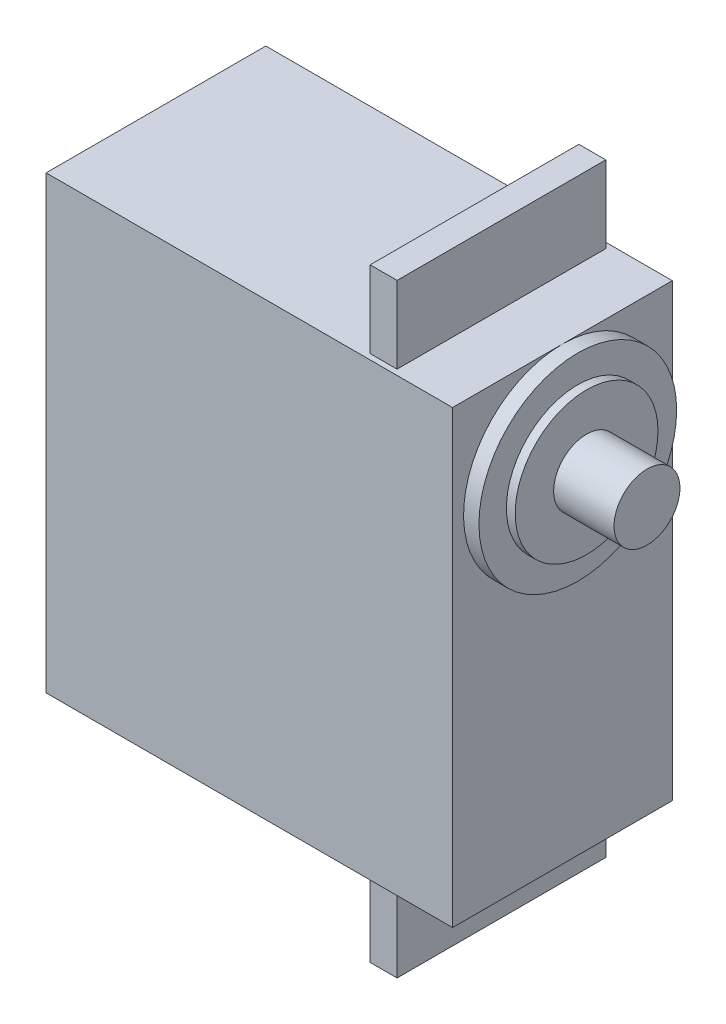
ISO-10303-21;
HEADER;
FILE_DESCRIPTION(('STEP AP214'),'2;1');
FILE_NAME('part.step','',(''),(''),'','','');
FILE_SCHEMA(('AUTOMOTIVE_DESIGN { 1 0 10303 214 1 1 1 1 }'));
ENDSEC;
DATA;
#1=APPLICATION_CONTEXT('core data for automotive mechanical design processes');
#2=APPLICATION_PROTOCOL_DEFINITION('international standard','automotive_design',2000,#1);
#3=PRODUCT_CONTEXT('',#1,'mechanical');
#4=PRODUCT('Part','Part','',(#3));
#5=PRODUCT_RELATED_PRODUCT_CATEGORY('part','',(#4));
#6=PRODUCT_DEFINITION_FORMATION('','',#4);
#7=PRODUCT_DEFINITION_CONTEXT('part definition',#1,'design');
#8=PRODUCT_DEFINITION('design','',#6,#7);
#9=PRODUCT_DEFINITION_SHAPE('','',#8);
#10=(LENGTH_UNIT() NAMED_UNIT(*) SI_UNIT(.MILLI.,.METRE.));
#11=(NAMED_UNIT(*) PLANE_ANGLE_UNIT() SI_UNIT($,.RADIAN.));
#12=(NAMED_UNIT(*) SI_UNIT($,.STERADIAN.) SOLID_ANGLE_UNIT());
#13=UNCERTAINTY_MEASURE_WITH_UNIT(LENGTH_MEASURE(1.E-05),#10,'distance_accuracy_value','');
#14=(GEOMETRIC_REPRESENTATION_CONTEXT(3) GLOBAL_UNCERTAINTY_ASSIGNED_CONTEXT((#13)) GLOBAL_UNIT_ASSIGNED_CONTEXT((#10,
#11,#12)) REPRESENTATION_CONTEXT('',''));
#15=CARTESIAN_POINT('',(0.,0.,0.));
#16=DIRECTION('',(0.,0.,1.));
#17=DIRECTION('',(1.,0.,0.));
#18=AXIS2_PLACEMENT_3D('',#15,#16,#17);
#19=CARTESIAN_POINT('',(37.,-22.7853910887685,11.0830391954629));
#20=DIRECTION('',(0.,1.,0.));
#21=DIRECTION('',(0.,0.,1.));
#22=AXIS2_PLACEMENT_3D('',#19,#20,#21);
#23=PLANE('',#22);
#24=DIRECTION('',(0.,0.,-1.));
#25=VECTOR('',#24,1.);
#26=CARTESIAN_POINT('',(0.,-22.7853910887685,11.0830391954629));
#27=LINE('',#26,#25);
#28=CARTESIAN_POINT('',(0.,-22.7853910887685,11.0830391954629));
#29=VERTEX_POINT('',#28);
#30=CARTESIAN_POINT('',(0.,-22.7853910887685,-8.9169608045371));
#31=VERTEX_POINT('',#30);
#32=EDGE_CURVE('E158',#29,#31,#27,.T.);
#33=ORIENTED_EDGE('',*,*,#32,.T.);
#34=DIRECTION('',(-1.,0.,0.));
#35=VECTOR('',#34,1.);
#36=CARTESIAN_POINT('',(37.,-22.7853910887685,-8.9169608045371));
#37=LINE('',#36,#35);
#38=CARTESIAN_POINT('',(37.,-22.7853910887685,-8.9169608045371));
#39=VERTEX_POINT('',#38);
#40=EDGE_CURVE('E11',#39,#31,#37,.T.);
#41=ORIENTED_EDGE('',*,*,#40,.F.);
#42=DIRECTION('',(0.,0.,-1.));
#43=VECTOR('',#42,1.);
#44=CARTESIAN_POINT('',(37.,-22.7853910887685,11.0830391954629));
#45=LINE('',#44,#43);
#46=CARTESIAN_POINT('',(37.,-22.7853910887685,11.0830391954629));
#47=VERTEX_POINT('',#46);
#48=EDGE_CURVE('E151',#47,#39,#45,.T.);
#49=ORIENTED_EDGE('',*,*,#48,.F.);
#50=DIRECTION('',(-1.,0.,0.));
#51=VECTOR('',#50,1.);
#52=CARTESIAN_POINT('',(37.,-22.7853910887685,11.0830391954629));
#53=LINE('',#52,#51);
#54=EDGE_CURVE('E157',#47,#29,#53,.T.);
#55=ORIENTED_EDGE('',*,*,#54,.T.);
#56=EDGE_LOOP('',(#33,#41,#49,#55));
#57=FACE_BOUND('',#56,.T.);
#58=DIRECTION('',(0.,0.,1.));
#59=VECTOR('',#58,1.);
#60=CARTESIAN_POINT('',(31.45,-22.7853910887685,-8.4169608045371));
#61=LINE('',#60,#59);
#62=CARTESIAN_POINT('',(31.45,-22.7853910887685,-8.4169608045371));
#63=VERTEX_POINT('',#62);
#64=CARTESIAN_POINT('',(31.45,-22.7853910887685,10.5830391954629));
#65=VERTEX_POINT('',#64);
#66=EDGE_CURVE('E262',#63,#65,#61,.T.);
#67=ORIENTED_EDGE('',*,*,#66,.F.);
#68=DIRECTION('',(1.,0.,0.));
#69=VECTOR('',#68,1.);
#70=CARTESIAN_POINT('',(31.45,-22.7853910887685,-8.4169608045371));
#71=LINE('',#70,#69);
#72=CARTESIAN_POINT('',(29.,-22.7853910887685,-8.4169608045371));
#73=VERTEX_POINT('',#72);
#74=EDGE_CURVE('E253',#73,#63,#71,.T.);
#75=ORIENTED_EDGE('',*,*,#74,.F.);
#76=DIRECTION('',(0.,0.,-1.));
#77=VECTOR('',#76,1.);
#78=CARTESIAN_POINT('',(29.,-22.7853910887685,-8.4169608045371));
#79=LINE('',#78,#77);
#80=CARTESIAN_POINT('',(29.,-22.7853910887685,10.5830391954629));
#81=VERTEX_POINT('',#80);
#82=EDGE_CURVE('E61',#81,#73,#79,.T.);
#83=ORIENTED_EDGE('',*,*,#82,.F.);
#84=DIRECTION('',(-1.,0.,0.));
#85=VECTOR('',#84,1.);
#86=CARTESIAN_POINT('',(31.45,-22.7853910887685,10.5830391954629));
#87=LINE('',#86,#85);
#88=EDGE_CURVE('E56',#65,#81,#87,.T.);
#89=ORIENTED_EDGE('',*,*,#88,.F.);
#90=EDGE_LOOP('',(#67,#75,#83,#89));
#91=FACE_BOUND('',#90,.T.);
#92=ADVANCED_FACE('F40',(#57,#91),#23,.F.);
#93=CARTESIAN_POINT('',(37.,18.2146089112315,11.0830391954629));
#94=DIRECTION('',(0.,1.,0.));
#95=DIRECTION('',(0.,0.,1.));
#96=AXIS2_PLACEMENT_3D('',#93,#94,#95);
#97=PLANE('',#96);
#98=DIRECTION('',(0.,0.,-1.));
#99=VECTOR('',#98,1.);
#100=CARTESIAN_POINT('',(0.,18.2146089112315,11.0830391954629));
#101=LINE('',#100,#99);
#102=CARTESIAN_POINT('',(0.,18.2146089112315,11.0830391954629));
#103=VERTEX_POINT('',#102);
#104=CARTESIAN_POINT('',(0.,18.2146089112315,-8.91696080453709));
#105=VERTEX_POINT('',#104);
#106=EDGE_CURVE('E167',#103,#105,#101,.T.);
#107=ORIENTED_EDGE('',*,*,#106,.F.);
#108=DIRECTION('',(-1.,0.,0.));
#109=VECTOR('',#108,1.);
#110=CARTESIAN_POINT('',(37.,18.2146089112315,11.0830391954629));
#111=LINE('',#110,#109);
#112=CARTESIAN_POINT('',(37.,18.2146089112315,11.0830391954629));
#113=VERTEX_POINT('',#112);
#114=EDGE_CURVE('E136',#113,#103,#111,.T.);
#115=ORIENTED_EDGE('',*,*,#114,.F.);
#116=DIRECTION('',(0.,0.,-1.));
#117=VECTOR('',#116,1.);
#118=CARTESIAN_POINT('',(37.,18.2146089112315,11.0830391954629));
#119=LINE('',#118,#117);
#120=CARTESIAN_POINT('',(37.,18.2146089112315,1.08303919546291));
#121=VERTEX_POINT('',#120);
#122=EDGE_CURVE('E129',#113,#121,#119,.T.);
#123=ORIENTED_EDGE('',*,*,#122,.T.);
#124=CARTESIAN_POINT('',(37.,18.2146089112315,-8.91696080453709));
#125=VERTEX_POINT('',#124);
#126=EDGE_CURVE('E134',#121,#125,#119,.T.);
#127=ORIENTED_EDGE('',*,*,#126,.T.);
#128=DIRECTION('',(-1.,0.,0.));
#129=VECTOR('',#128,1.);
#130=CARTESIAN_POINT('',(37.,18.2146089112315,-8.91696080453709));
#131=LINE('',#130,#129);
#132=EDGE_CURVE('E49',#125,#105,#131,.T.);
#133=ORIENTED_EDGE('',*,*,#132,.T.);
#134=EDGE_LOOP('',(#107,#115,#123,#127,#133));
#135=FACE_BOUND('',#134,.T.);
#136=DIRECTION('',(0.,0.,1.));
#137=VECTOR('',#136,1.);
#138=CARTESIAN_POINT('',(31.45,18.2146089112315,-8.41696080453709));
#139=LINE('',#138,#137);
#140=CARTESIAN_POINT('',(31.45,18.2146089112315,-8.41696080453709));
#141=VERTEX_POINT('',#140);
#142=CARTESIAN_POINT('',(31.45,18.2146089112315,10.5830391954629));
#143=VERTEX_POINT('',#142);
#144=EDGE_CURVE('E217',#141,#143,#139,.T.);
#145=ORIENTED_EDGE('',*,*,#144,.T.);
#146=DIRECTION('',(1.,0.,0.));
#147=VECTOR('',#146,1.);
#148=CARTESIAN_POINT('',(29.,18.2146089112315,10.5830391954629));
#149=LINE('',#148,#147);
#150=CARTESIAN_POINT('',(29.,18.2146089112315,10.5830391954629));
#151=VERTEX_POINT('',#150);
#152=EDGE_CURVE('E221',#151,#143,#149,.T.);
#153=ORIENTED_EDGE('',*,*,#152,.F.);
#154=DIRECTION('',(0.,0.,1.));
#155=VECTOR('',#154,1.);
#156=CARTESIAN_POINT('',(29.,18.2146089112315,-8.4169608045371));
#157=LINE('',#156,#155);
#158=CARTESIAN_POINT('',(29.,18.2146089112315,-8.4169608045371));
#159=VERTEX_POINT('',#158);
#160=EDGE_CURVE('E209',#159,#151,#157,.T.);
#161=ORIENTED_EDGE('',*,*,#160,.F.);
#162=DIRECTION('',(1.,0.,0.));
#163=VECTOR('',#162,1.);
#164=CARTESIAN_POINT('',(29.,18.2146089112315,-8.4169608045371));
#165=LINE('',#164,#163);
#166=EDGE_CURVE('E213',#159,#141,#165,.T.);
#167=ORIENTED_EDGE('',*,*,#166,.T.);
#168=EDGE_LOOP('',(#145,#153,#161,#167));
#169=FACE_BOUND('',#168,.T.);
#170=ADVANCED_FACE('F132',(#135,#169),#97,.T.);
#171=CARTESIAN_POINT('',(37.,18.2146089112315,-8.91696080453709));
#172=DIRECTION('',(0.,0.,-1.));
#173=DIRECTION('',(0.,1.,0.));
#174=AXIS2_PLACEMENT_3D('',#171,#172,#173);
#175=PLANE('',#174);
#176=DIRECTION('',(0.,-1.,0.));
#177=VECTOR('',#176,1.);
#178=CARTESIAN_POINT('',(0.,18.2146089112315,-8.91696080453709));
#179=LINE('',#178,#177);
#180=EDGE_CURVE('E162',#105,#31,#179,.T.);
#181=ORIENTED_EDGE('',*,*,#180,.F.);
#182=ORIENTED_EDGE('',*,*,#132,.F.);
#183=DIRECTION('',(0.,-1.,0.));
#184=VECTOR('',#183,1.);
#185=CARTESIAN_POINT('',(37.,18.2146089112315,-8.91696080453709));
#186=LINE('',#185,#184);
#187=EDGE_CURVE('E148',#125,#39,#186,.T.);
#188=ORIENTED_EDGE('',*,*,#187,.T.);
#189=ORIENTED_EDGE('',*,*,#40,.T.);
#190=EDGE_LOOP('',(#181,#182,#188,#189));
#191=FACE_BOUND('',#190,.T.);
#192=ADVANCED_FACE('F182',(#191),#175,.T.);
#193=CARTESIAN_POINT('',(37.,18.2146089112315,11.0830391954629));
#194=DIRECTION('',(0.,0.,-1.));
#195=DIRECTION('',(0.,1.,0.));
#196=AXIS2_PLACEMENT_3D('',#193,#194,#195);
#197=PLANE('',#196);
#198=DIRECTION('',(0.,-1.,0.));
#199=VECTOR('',#198,1.);
#200=CARTESIAN_POINT('',(0.,18.2146089112315,11.0830391954629));
#201=LINE('',#200,#199);
#202=EDGE_CURVE('E171',#103,#29,#201,.T.);
#203=ORIENTED_EDGE('',*,*,#202,.T.);
#204=ORIENTED_EDGE('',*,*,#54,.F.);
#205=DIRECTION('',(0.,-1.,0.));
#206=VECTOR('',#205,1.);
#207=CARTESIAN_POINT('',(37.,18.2146089112315,11.0830391954629));
#208=LINE('',#207,#206);
#209=EDGE_CURVE('E141',#113,#47,#208,.T.);
#210=ORIENTED_EDGE('',*,*,#209,.F.);
#211=ORIENTED_EDGE('',*,*,#114,.T.);
#212=EDGE_LOOP('',(#203,#204,#210,#211));
#213=FACE_BOUND('',#212,.T.);
#214=ADVANCED_FACE('F190',(#213),#197,.F.);
#215=CARTESIAN_POINT('',(37.,0.,0.));
#216=DIRECTION('',(-1.,0.,0.));
#217=DIRECTION('',(0.,0.,1.));
#218=AXIS2_PLACEMENT_3D('',#215,#216,#217);
#219=PLANE('',#218);
#220=ORIENTED_EDGE('',*,*,#126,.F.);
#221=CARTESIAN_POINT('',(37.,9.21460891123148,1.08303919546291));
#222=DIRECTION('',(1.,0.,0.));
#223=DIRECTION('',(0.,0.,-1.));
#224=AXIS2_PLACEMENT_3D('',#221,#222,#223);
#225=CIRCLE('',#224,9.);
#226=EDGE_CURVE('E146',#121,#121,#225,.T.);
#227=ORIENTED_EDGE('',*,*,#226,.F.);
#228=ORIENTED_EDGE('',*,*,#122,.F.);
#229=ORIENTED_EDGE('',*,*,#209,.T.);
#230=ORIENTED_EDGE('',*,*,#48,.T.);
#231=ORIENTED_EDGE('',*,*,#187,.F.);
#232=EDGE_LOOP('',(#220,#227,#228,#229,#230,#231));
#233=FACE_BOUND('',#232,.T.);
#234=ADVANCED_FACE('F144',(#233),#219,.F.);
#235=CARTESIAN_POINT('',(0.,0.,0.));
#236=DIRECTION('',(-1.,0.,0.));
#237=DIRECTION('',(0.,0.,1.));
#238=AXIS2_PLACEMENT_3D('',#235,#236,#237);
#239=PLANE('',#238);
#240=ORIENTED_EDGE('',*,*,#32,.F.);
#241=ORIENTED_EDGE('',*,*,#202,.F.);
#242=ORIENTED_EDGE('',*,*,#106,.T.);
#243=ORIENTED_EDGE('',*,*,#180,.T.);
#244=EDGE_LOOP('',(#240,#241,#242,#243));
#245=FACE_BOUND('',#244,.T.);
#246=ADVANCED_FACE('F187',(#245),#239,.T.);
#247=CARTESIAN_POINT('',(29.,25.2146089112315,10.5830391954629));
#248=DIRECTION('',(0.,0.,-1.));
#249=DIRECTION('',(-1.,0.,0.));
#250=AXIS2_PLACEMENT_3D('',#247,#248,#249);
#251=PLANE('',#250);
#252=ORIENTED_EDGE('',*,*,#152,.T.);
#253=DIRECTION('',(0.,-1.,0.));
#254=VECTOR('',#253,1.);
#255=CARTESIAN_POINT('',(31.45,25.2146089112315,10.5830391954629));
#256=LINE('',#255,#254);
#257=CARTESIAN_POINT('',(31.45,25.2146089112315,10.5830391954629));
#258=VERTEX_POINT('',#257);
#259=EDGE_CURVE('E163',#258,#143,#256,.T.);
#260=ORIENTED_EDGE('',*,*,#259,.F.);
#261=DIRECTION('',(1.,0.,0.));
#262=VECTOR('',#261,1.);
#263=CARTESIAN_POINT('',(29.,25.2146089112315,10.5830391954629));
#264=LINE('',#263,#262);
#265=CARTESIAN_POINT('',(29.,25.2146089112315,10.5830391954629));
#266=VERTEX_POINT('',#265);
#267=EDGE_CURVE('E212',#266,#258,#264,.T.);
#268=ORIENTED_EDGE('',*,*,#267,.F.);
#269=DIRECTION('',(0.,-1.,0.));
#270=VECTOR('',#269,1.);
#271=CARTESIAN_POINT('',(29.,25.2146089112315,10.5830391954629));
#272=LINE('',#271,#270);
#273=EDGE_CURVE('E204',#266,#151,#272,.T.);
#274=ORIENTED_EDGE('',*,*,#273,.T.);
#275=EDGE_LOOP('',(#252,#260,#268,#274));
#276=FACE_BOUND('',#275,.T.);
#277=ADVANCED_FACE('F330',(#276),#251,.F.);
#278=CARTESIAN_POINT('',(31.45,25.2146089112315,-8.41696080453709));
#279=DIRECTION('',(1.,0.,0.));
#280=DIRECTION('',(0.,0.,-1.));
#281=AXIS2_PLACEMENT_3D('',#278,#279,#280);
#282=PLANE('',#281);
#283=ORIENTED_EDGE('',*,*,#144,.F.);
#284=DIRECTION('',(0.,-1.,0.));
#285=VECTOR('',#284,1.);
#286=CARTESIAN_POINT('',(31.45,25.2146089112315,-8.41696080453709));
#287=LINE('',#286,#285);
#288=CARTESIAN_POINT('',(31.45,25.2146089112315,-8.41696080453709));
#289=VERTEX_POINT('',#288);
#290=EDGE_CURVE('E197',#289,#141,#287,.T.);
#291=ORIENTED_EDGE('',*,*,#290,.F.);
#292=DIRECTION('',(0.,0.,1.));
#293=VECTOR('',#292,1.);
#294=CARTESIAN_POINT('',(31.45,25.2146089112315,-8.41696080453709));
#295=LINE('',#294,#293);
#296=EDGE_CURVE('E232',#289,#258,#295,.T.);
#297=ORIENTED_EDGE('',*,*,#296,.T.);
#298=ORIENTED_EDGE('',*,*,#259,.T.);
#299=EDGE_LOOP('',(#283,#291,#297,#298));
#300=FACE_BOUND('',#299,.T.);
#301=ADVANCED_FACE('F335',(#300),#282,.T.);
#302=CARTESIAN_POINT('',(29.,25.2146089112315,-8.4169608045371));
#303=DIRECTION('',(0.,0.,-1.));
#304=DIRECTION('',(-1.,0.,0.));
#305=AXIS2_PLACEMENT_3D('',#302,#303,#304);
#306=PLANE('',#305);
#307=ORIENTED_EDGE('',*,*,#166,.F.);
#308=DIRECTION('',(0.,-1.,0.));
#309=VECTOR('',#308,1.);
#310=CARTESIAN_POINT('',(29.,25.2146089112315,-8.4169608045371));
#311=LINE('',#310,#309);
#312=CARTESIAN_POINT('',(29.,25.2146089112315,-8.4169608045371));
#313=VERTEX_POINT('',#312);
#314=EDGE_CURVE('E200',#313,#159,#311,.T.);
#315=ORIENTED_EDGE('',*,*,#314,.F.);
#316=DIRECTION('',(1.,0.,0.));
#317=VECTOR('',#316,1.);
#318=CARTESIAN_POINT('',(29.,25.2146089112315,-8.4169608045371));
#319=LINE('',#318,#317);
#320=EDGE_CURVE('E228',#313,#289,#319,.T.);
#321=ORIENTED_EDGE('',*,*,#320,.T.);
#322=ORIENTED_EDGE('',*,*,#290,.T.);
#323=EDGE_LOOP('',(#307,#315,#321,#322));
#324=FACE_BOUND('',#323,.T.);
#325=ADVANCED_FACE('F339',(#324),#306,.T.);
#326=CARTESIAN_POINT('',(29.,25.2146089112315,-8.4169608045371));
#327=DIRECTION('',(1.,0.,0.));
#328=DIRECTION('',(0.,0.,-1.));
#329=AXIS2_PLACEMENT_3D('',#326,#327,#328);
#330=PLANE('',#329);
#331=ORIENTED_EDGE('',*,*,#160,.T.);
#332=ORIENTED_EDGE('',*,*,#273,.F.);
#333=DIRECTION('',(0.,0.,1.));
#334=VECTOR('',#333,1.);
#335=CARTESIAN_POINT('',(29.,25.2146089112315,-8.4169608045371));
#336=LINE('',#335,#334);
#337=EDGE_CURVE('E208',#313,#266,#336,.T.);
#338=ORIENTED_EDGE('',*,*,#337,.F.);
#339=ORIENTED_EDGE('',*,*,#314,.T.);
#340=EDGE_LOOP('',(#331,#332,#338,#339));
#341=FACE_BOUND('',#340,.T.);
#342=ADVANCED_FACE('F343',(#341),#330,.F.);
#343=CARTESIAN_POINT('',(0.,25.2146089112315,0.));
#344=DIRECTION('',(0.,-1.,0.));
#345=DIRECTION('',(0.,0.,-1.));
#346=AXIS2_PLACEMENT_3D('',#343,#344,#345);
#347=PLANE('',#346);
#348=ORIENTED_EDGE('',*,*,#267,.T.);
#349=ORIENTED_EDGE('',*,*,#296,.F.);
#350=ORIENTED_EDGE('',*,*,#320,.F.);
#351=ORIENTED_EDGE('',*,*,#337,.T.);
#352=EDGE_LOOP('',(#348,#349,#350,#351));
#353=FACE_BOUND('',#352,.T.);
#354=ADVANCED_FACE('F347',(#353),#347,.F.);
#355=CARTESIAN_POINT('',(31.45,-29.7853910887685,-8.4169608045371));
#356=DIRECTION('',(-1.,0.,0.));
#357=DIRECTION('',(0.,0.,1.));
#358=AXIS2_PLACEMENT_3D('',#355,#356,#357);
#359=PLANE('',#358);
#360=ORIENTED_EDGE('',*,*,#66,.T.);
#361=DIRECTION('',(0.,1.,0.));
#362=VECTOR('',#361,1.);
#363=CARTESIAN_POINT('',(31.45,-29.7853910887685,10.5830391954629));
#364=LINE('',#363,#362);
#365=CARTESIAN_POINT('',(31.45,-29.7853910887685,10.5830391954629));
#366=VERTEX_POINT('',#365);
#367=EDGE_CURVE('E225',#366,#65,#364,.T.);
#368=ORIENTED_EDGE('',*,*,#367,.F.);
#369=DIRECTION('',(0.,0.,1.));
#370=VECTOR('',#369,1.);
#371=CARTESIAN_POINT('',(31.45,-29.7853910887685,-8.4169608045371));
#372=LINE('',#371,#370);
#373=CARTESIAN_POINT('',(31.45,-29.7853910887685,-8.4169608045371));
#374=VERTEX_POINT('',#373);
#375=EDGE_CURVE('E257',#374,#366,#372,.T.);
#376=ORIENTED_EDGE('',*,*,#375,.F.);
#377=DIRECTION('',(0.,1.,0.));
#378=VECTOR('',#377,1.);
#379=CARTESIAN_POINT('',(31.45,-29.7853910887685,-8.4169608045371));
#380=LINE('',#379,#378);
#381=EDGE_CURVE('E248',#374,#63,#380,.T.);
#382=ORIENTED_EDGE('',*,*,#381,.T.);
#383=EDGE_LOOP('',(#360,#368,#376,#382));
#384=FACE_BOUND('',#383,.T.);
#385=ADVANCED_FACE('F351',(#384),#359,.F.);
#386=CARTESIAN_POINT('',(31.45,-29.7853910887685,10.5830391954629));
#387=DIRECTION('',(0.,0.,-1.));
#388=DIRECTION('',(-1.,0.,0.));
#389=AXIS2_PLACEMENT_3D('',#386,#387,#388);
#390=PLANE('',#389);
#391=ORIENTED_EDGE('',*,*,#88,.T.);
#392=DIRECTION('',(0.,1.,0.));
#393=VECTOR('',#392,1.);
#394=CARTESIAN_POINT('',(29.,-29.7853910887685,10.5830391954629));
#395=LINE('',#394,#393);
#396=CARTESIAN_POINT('',(29.,-29.7853910887685,10.5830391954629));
#397=VERTEX_POINT('',#396);
#398=EDGE_CURVE('E240',#397,#81,#395,.T.);
#399=ORIENTED_EDGE('',*,*,#398,.F.);
#400=DIRECTION('',(-1.,0.,0.));
#401=VECTOR('',#400,1.);
#402=CARTESIAN_POINT('',(31.45,-29.7853910887685,10.5830391954629));
#403=LINE('',#402,#401);
#404=EDGE_CURVE('E272',#366,#397,#403,.T.);
#405=ORIENTED_EDGE('',*,*,#404,.F.);
#406=ORIENTED_EDGE('',*,*,#367,.T.);
#407=EDGE_LOOP('',(#391,#399,#405,#406));
#408=FACE_BOUND('',#407,.T.);
#409=ADVANCED_FACE('F355',(#408),#390,.F.);
#410=CARTESIAN_POINT('',(29.,-29.7853910887685,-8.4169608045371));
#411=DIRECTION('',(1.,0.,0.));
#412=DIRECTION('',(0.,0.,-1.));
#413=AXIS2_PLACEMENT_3D('',#410,#411,#412);
#414=PLANE('',#413);
#415=ORIENTED_EDGE('',*,*,#82,.T.);
#416=DIRECTION('',(0.,1.,0.));
#417=VECTOR('',#416,1.);
#418=CARTESIAN_POINT('',(29.,-29.7853910887685,-8.4169608045371));
#419=LINE('',#418,#417);
#420=CARTESIAN_POINT('',(29.,-29.7853910887685,-8.4169608045371));
#421=VERTEX_POINT('',#420);
#422=EDGE_CURVE('E244',#421,#73,#419,.T.);
#423=ORIENTED_EDGE('',*,*,#422,.F.);
#424=DIRECTION('',(0.,0.,-1.));
#425=VECTOR('',#424,1.);
#426=CARTESIAN_POINT('',(29.,-29.7853910887685,-8.4169608045371));
#427=LINE('',#426,#425);
#428=EDGE_CURVE('E269',#397,#421,#427,.T.);
#429=ORIENTED_EDGE('',*,*,#428,.F.);
#430=ORIENTED_EDGE('',*,*,#398,.T.);
#431=EDGE_LOOP('',(#415,#423,#429,#430));
#432=FACE_BOUND('',#431,.T.);
#433=ADVANCED_FACE('F359',(#432),#414,.F.);
#434=CARTESIAN_POINT('',(31.45,-29.7853910887685,-8.4169608045371));
#435=DIRECTION('',(0.,0.,1.));
#436=DIRECTION('',(1.,0.,0.));
#437=AXIS2_PLACEMENT_3D('',#434,#435,#436);
#438=PLANE('',#437);
#439=ORIENTED_EDGE('',*,*,#74,.T.);
#440=ORIENTED_EDGE('',*,*,#381,.F.);
#441=DIRECTION('',(1.,0.,0.));
#442=VECTOR('',#441,1.);
#443=CARTESIAN_POINT('',(31.45,-29.7853910887685,-8.4169608045371));
#444=LINE('',#443,#442);
#445=EDGE_CURVE('E252',#421,#374,#444,.T.);
#446=ORIENTED_EDGE('',*,*,#445,.F.);
#447=ORIENTED_EDGE('',*,*,#422,.T.);
#448=EDGE_LOOP('',(#439,#440,#446,#447));
#449=FACE_BOUND('',#448,.T.);
#450=ADVANCED_FACE('F363',(#449),#438,.F.);
#451=CARTESIAN_POINT('',(0.,-29.7853910887685,0.));
#452=DIRECTION('',(0.,-1.,0.));
#453=DIRECTION('',(0.,0.,-1.));
#454=AXIS2_PLACEMENT_3D('',#451,#452,#453);
#455=PLANE('',#454);
#456=ORIENTED_EDGE('',*,*,#375,.T.);
#457=ORIENTED_EDGE('',*,*,#404,.T.);
#458=ORIENTED_EDGE('',*,*,#428,.T.);
#459=ORIENTED_EDGE('',*,*,#445,.T.);
#460=EDGE_LOOP('',(#456,#457,#458,#459));
#461=FACE_BOUND('',#460,.T.);
#462=ADVANCED_FACE('F367',(#461),#455,.T.);
#463=CARTESIAN_POINT('',(38.4,9.21460891123148,1.08303919546291));
#464=DIRECTION('',(-1.,0.,0.));
#465=DIRECTION('',(0.,0.,1.));
#466=AXIS2_PLACEMENT_3D('',#463,#464,#465);
#467=CYLINDRICAL_SURFACE('',#466,9.);
#468=CARTESIAN_POINT('',(38.4,9.21460891123148,1.08303919546291));
#469=DIRECTION('',(1.,0.,0.));
#470=DIRECTION('',(0.,0.,-1.));
#471=AXIS2_PLACEMENT_3D('',#468,#469,#470);
#472=CIRCLE('',#471,9.);
#473=CARTESIAN_POINT('',(38.4,9.21460891123148,-7.91696080453709));
#474=VERTEX_POINT('',#473);
#475=EDGE_CURVE('E281',#474,#474,#472,.T.);
#476=ORIENTED_EDGE('',*,*,#475,.F.);
#477=EDGE_LOOP('',(#476));
#478=FACE_BOUND('',#477,.T.);
#479=ORIENTED_EDGE('',*,*,#226,.T.);
#480=EDGE_LOOP('',(#479));
#481=FACE_BOUND('',#480,.T.);
#482=ADVANCED_FACE('F371',(#478,#481),#467,.T.);
#483=CARTESIAN_POINT('',(38.4,0.,0.));
#484=DIRECTION('',(1.,0.,0.));
#485=DIRECTION('',(0.,0.,-1.));
#486=AXIS2_PLACEMENT_3D('',#483,#484,#485);
#487=PLANE('',#486);
#488=CARTESIAN_POINT('',(38.4,9.21460891123148,1.08303919546291));
#489=DIRECTION('',(1.,0.,0.));
#490=DIRECTION('',(0.,0.,-1.));
#491=AXIS2_PLACEMENT_3D('',#488,#489,#490);
#492=CIRCLE('',#491,6.5);
#493=CARTESIAN_POINT('',(38.4,9.21460891123148,-5.4169608045371));
#494=VERTEX_POINT('',#493);
#495=EDGE_CURVE('E287',#494,#494,#492,.T.);
#496=ORIENTED_EDGE('',*,*,#495,.F.);
#497=EDGE_LOOP('',(#496));
#498=FACE_BOUND('',#497,.T.);
#499=ORIENTED_EDGE('',*,*,#475,.T.);
#500=EDGE_LOOP('',(#499));
#501=FACE_BOUND('',#500,.T.);
#502=ADVANCED_FACE('F314',(#498,#501),#487,.T.);
#503=CARTESIAN_POINT('',(39.2,9.21460891123148,1.08303919546291));
#504=DIRECTION('',(-1.,0.,0.));
#505=DIRECTION('',(0.,0.,1.));
#506=AXIS2_PLACEMENT_3D('',#503,#504,#505);
#507=CYLINDRICAL_SURFACE('',#506,6.5);
#508=CARTESIAN_POINT('',(39.2,9.21460891123148,1.08303919546291));
#509=DIRECTION('',(1.,0.,0.));
#510=DIRECTION('',(0.,0.,-1.));
#511=AXIS2_PLACEMENT_3D('',#508,#509,#510);
#512=CIRCLE('',#511,6.5);
#513=CARTESIAN_POINT('',(39.2,9.21460891123148,-5.4169608045371));
#514=VERTEX_POINT('',#513);
#515=EDGE_CURVE('E291',#514,#514,#512,.T.);
#516=ORIENTED_EDGE('',*,*,#515,.F.);
#517=EDGE_LOOP('',(#516));
#518=FACE_BOUND('',#517,.T.);
#519=ORIENTED_EDGE('',*,*,#495,.T.);
#520=EDGE_LOOP('',(#519));
#521=FACE_BOUND('',#520,.T.);
#522=ADVANCED_FACE('F306',(#518,#521),#507,.T.);
#523=CARTESIAN_POINT('',(39.2,9.21460891123148,1.08303919546291));
#524=DIRECTION('',(1.,0.,0.));
#525=DIRECTION('',(0.,0.,-1.));
#526=AXIS2_PLACEMENT_3D('',#523,#524,#525);
#527=PLANE('',#526);
#528=CARTESIAN_POINT('',(39.2,9.21460891123148,1.08303919546291));
#529=DIRECTION('',(1.,0.,0.));
#530=DIRECTION('',(0.,0.,-1.));
#531=AXIS2_PLACEMENT_3D('',#528,#529,#530);
#532=CIRCLE('',#531,3.);
#533=CARTESIAN_POINT('',(39.2,9.21460891123148,4.08303919546291));
#534=VERTEX_POINT('',#533);
#535=EDGE_CURVE('E43',#534,#534,#532,.T.);
#536=ORIENTED_EDGE('',*,*,#535,.F.);
#537=EDGE_LOOP('',(#536));
#538=FACE_BOUND('',#537,.T.);
#539=ORIENTED_EDGE('',*,*,#515,.T.);
#540=EDGE_LOOP('',(#539));
#541=FACE_BOUND('',#540,.T.);
#542=ADVANCED_FACE('F303',(#538,#541),#527,.T.);
#543=CARTESIAN_POINT('',(44.7,9.21460891123148,1.08303919546291));
#544=DIRECTION('',(1.,0.,0.));
#545=DIRECTION('',(0.,0.,-1.));
#546=AXIS2_PLACEMENT_3D('',#543,#544,#545);
#547=PLANE('',#546);
#548=CARTESIAN_POINT('',(44.7,9.21460891123148,1.08303919546291));
#549=DIRECTION('',(1.,0.,0.));
#550=DIRECTION('',(0.,0.,-1.));
#551=AXIS2_PLACEMENT_3D('',#548,#549,#550);
#552=CIRCLE('',#551,3.);
#553=CARTESIAN_POINT('',(44.7,9.21460891123148,4.08303919546291));
#554=VERTEX_POINT('',#553);
#555=EDGE_CURVE('E266',#554,#554,#552,.T.);
#556=ORIENTED_EDGE('',*,*,#555,.T.);
#557=EDGE_LOOP('',(#556));
#558=FACE_BOUND('',#557,.T.);
#559=ADVANCED_FACE('F305',(#558),#547,.T.);
#560=CARTESIAN_POINT('',(44.7,9.21460891123148,1.08303919546291));
#561=DIRECTION('',(-1.,0.,0.));
#562=DIRECTION('',(0.,0.,1.));
#563=AXIS2_PLACEMENT_3D('',#560,#561,#562);
#564=CYLINDRICAL_SURFACE('',#563,3.);
#565=CARTESIAN_POINT('',(39.2,9.21460891123148,4.08303919546291));
#566=CARTESIAN_POINT('',(39.2572916666667,9.21460891123148,4.08303919546291));
#567=CARTESIAN_POINT('',(39.3145833333333,9.21460891123148,4.08303919546291));
#568=CARTESIAN_POINT('',(39.4291666666667,9.21460891123148,4.08303919546291));
#569=CARTESIAN_POINT('',(39.4864583333333,9.21460891123148,4.08303919546291));
#570=CARTESIAN_POINT('',(39.6010416666667,9.21460891123148,4.08303919546291));
#571=CARTESIAN_POINT('',(39.6583333333333,9.21460891123148,4.08303919546291));
#572=CARTESIAN_POINT('',(39.7729166666667,9.21460891123148,4.08303919546291));
#573=CARTESIAN_POINT('',(39.8302083333333,9.21460891123148,4.08303919546291));
#574=CARTESIAN_POINT('',(39.9447916666667,9.21460891123148,4.08303919546291));
#575=CARTESIAN_POINT('',(40.0020833333333,9.21460891123148,4.08303919546291));
#576=CARTESIAN_POINT('',(40.1166666666667,9.21460891123148,4.08303919546291));
#577=CARTESIAN_POINT('',(40.1739583333333,9.21460891123148,4.08303919546291));
#578=CARTESIAN_POINT('',(40.2885416666667,9.21460891123148,4.08303919546291));
#579=CARTESIAN_POINT('',(40.3458333333333,9.21460891123148,4.08303919546291));
#580=CARTESIAN_POINT('',(40.4604166666667,9.21460891123148,4.08303919546291));
#581=CARTESIAN_POINT('',(40.5177083333333,9.21460891123148,4.08303919546291));
#582=CARTESIAN_POINT('',(40.6322916666667,9.21460891123148,4.08303919546291));
#583=CARTESIAN_POINT('',(40.6895833333333,9.21460891123148,4.08303919546291));
#584=CARTESIAN_POINT('',(40.8041666666667,9.21460891123148,4.08303919546291));
#585=CARTESIAN_POINT('',(40.8614583333333,9.21460891123148,4.08303919546291));
#586=CARTESIAN_POINT('',(40.9760416666667,9.21460891123148,4.08303919546291));
#587=CARTESIAN_POINT('',(41.0333333333333,9.21460891123148,4.08303919546291));
#588=CARTESIAN_POINT('',(41.1479166666667,9.21460891123148,4.08303919546291));
#589=CARTESIAN_POINT('',(41.2052083333333,9.21460891123148,4.08303919546291));
#590=CARTESIAN_POINT('',(41.3197916666667,9.21460891123148,4.08303919546291));
#591=CARTESIAN_POINT('',(41.3770833333333,9.21460891123148,4.08303919546291));
#592=CARTESIAN_POINT('',(41.4916666666667,9.21460891123148,4.08303919546291));
#593=CARTESIAN_POINT('',(41.5489583333333,9.21460891123148,4.08303919546291));
#594=CARTESIAN_POINT('',(41.6635416666667,9.21460891123148,4.08303919546291));
#595=CARTESIAN_POINT('',(41.7208333333333,9.21460891123148,4.08303919546291));
#596=CARTESIAN_POINT('',(41.8354166666667,9.21460891123148,4.08303919546291));
#597=CARTESIAN_POINT('',(41.8927083333333,9.21460891123148,4.08303919546291));
#598=CARTESIAN_POINT('',(42.0072916666667,9.21460891123148,4.08303919546291));
#599=CARTESIAN_POINT('',(42.0645833333333,9.21460891123148,4.08303919546291));
#600=CARTESIAN_POINT('',(42.1791666666667,9.21460891123148,4.08303919546291));
#601=CARTESIAN_POINT('',(42.2364583333333,9.21460891123148,4.08303919546291));
#602=CARTESIAN_POINT('',(42.3510416666667,9.21460891123148,4.08303919546291));
#603=CARTESIAN_POINT('',(42.4083333333333,9.21460891123148,4.08303919546291));
#604=CARTESIAN_POINT('',(42.5229166666667,9.21460891123148,4.08303919546291));
#605=CARTESIAN_POINT('',(42.5802083333333,9.21460891123148,4.08303919546291));
#606=CARTESIAN_POINT('',(42.6947916666667,9.21460891123148,4.08303919546291));
#607=CARTESIAN_POINT('',(42.7520833333333,9.21460891123148,4.08303919546291));
#608=CARTESIAN_POINT('',(42.8666666666667,9.21460891123148,4.08303919546291));
#609=CARTESIAN_POINT('',(42.9239583333333,9.21460891123148,4.08303919546291));
#610=CARTESIAN_POINT('',(43.0385416666667,9.21460891123148,4.08303919546291));
#611=CARTESIAN_POINT('',(43.0958333333333,9.21460891123148,4.08303919546291));
#612=CARTESIAN_POINT('',(43.2104166666667,9.21460891123148,4.08303919546291));
#613=CARTESIAN_POINT('',(43.2677083333333,9.21460891123148,4.08303919546291));
#614=CARTESIAN_POINT('',(43.3822916666667,9.21460891123148,4.08303919546291));
#615=CARTESIAN_POINT('',(43.4395833333333,9.21460891123148,4.08303919546291));
#616=CARTESIAN_POINT('',(43.5541666666667,9.21460891123148,4.08303919546291));
#617=CARTESIAN_POINT('',(43.6114583333333,9.21460891123148,4.08303919546291));
#618=CARTESIAN_POINT('',(43.7260416666667,9.21460891123148,4.08303919546291));
#619=CARTESIAN_POINT('',(43.7833333333333,9.21460891123148,4.08303919546291));
#620=CARTESIAN_POINT('',(43.8979166666667,9.21460891123148,4.08303919546291));
#621=CARTESIAN_POINT('',(43.9552083333333,9.21460891123148,4.08303919546291));
#622=CARTESIAN_POINT('',(44.0697916666667,9.21460891123148,4.08303919546291));
#623=CARTESIAN_POINT('',(44.1270833333333,9.21460891123148,4.08303919546291));
#624=CARTESIAN_POINT('',(44.2416666666667,9.21460891123148,4.08303919546291));
#625=CARTESIAN_POINT('',(44.2989583333333,9.21460891123148,4.08303919546291));
#626=CARTESIAN_POINT('',(44.4135416666667,9.21460891123148,4.08303919546291));
#627=CARTESIAN_POINT('',(44.4708333333333,9.21460891123148,4.08303919546291));
#628=CARTESIAN_POINT('',(44.5854166666667,9.21460891123148,4.08303919546291));
#629=CARTESIAN_POINT('',(44.6427083333333,9.21460891123148,4.08303919546291));
#630=CARTESIAN_POINT('',(44.7,9.21460891123148,4.08303919546291));
#631=B_SPLINE_CURVE_WITH_KNOTS('',3,(#565,#566,#567,#568,#569,#570,#571,#572,#573,#574,#575,
#576,#577,#578,#579,#580,#581,#582,#583,#584,#585,#586,#587,#588,#589,#590,#591,#592,#593,#594,
#595,#596,#597,#598,#599,#600,#601,#602,#603,#604,#605,#606,#607,#608,#609,#610,#611,#612,#613,
#614,#615,#616,#617,#618,#619,#620,#621,#622,#623,#624,#625,#626,#627,#628,#629,#630),
.UNSPECIFIED.,.F.,.F.,(4,2,2,2,2,2,2,2,2,2,2,2,2,2,2,2,2,2,2,2,2,2,2,2,2,2,2,2,2,2,2,2,4),(0.,
0.171875000000002,0.343750000000004,0.515625000000006,0.687500000000001,0.859375000000002,
1.03125,1.20312500000001,1.375,1.546875,1.71875,1.890625,2.0625,2.234375,2.40625000000001,
2.578125,2.75,2.921875,3.09375,3.265625,3.4375,3.609375,3.78125,3.953125,4.125,4.296875,4.46875,
4.640625,4.8125,4.984375,5.15625,5.328125,5.50000000000001),.UNSPECIFIED.);
#632=EDGE_CURVE('BSEAM300',#534,#554,#631,.T.);
#633=ORIENTED_EDGE('',*,*,#535,.T.);
#634=ORIENTED_EDGE('',*,*,#555,.F.);
#635=ORIENTED_EDGE('',*,*,#632,.T.);
#636=ORIENTED_EDGE('',*,*,#632,.F.);
#637=EDGE_LOOP('',(#633,#635,#634,#636));
#638=FACE_BOUND('',#637,.T.);
#639=ADVANCED_FACE('F300',(#638),#564,.T.);
#640=CLOSED_SHELL('',(#92,#170,#192,#214,#234,#246,#277,#301,#325,#342,#354,#385,#409,#433,#450,
#462,#482,#502,#522,#542,#559,#639));
#641=MANIFOLD_SOLID_BREP('B2',#640);
#642=ADVANCED_BREP_SHAPE_REPRESENTATION('',(#18,#641),#14);
#643=SHAPE_DEFINITION_REPRESENTATION(#9,#642);
ENDSEC;
END-ISO-10303-21;
